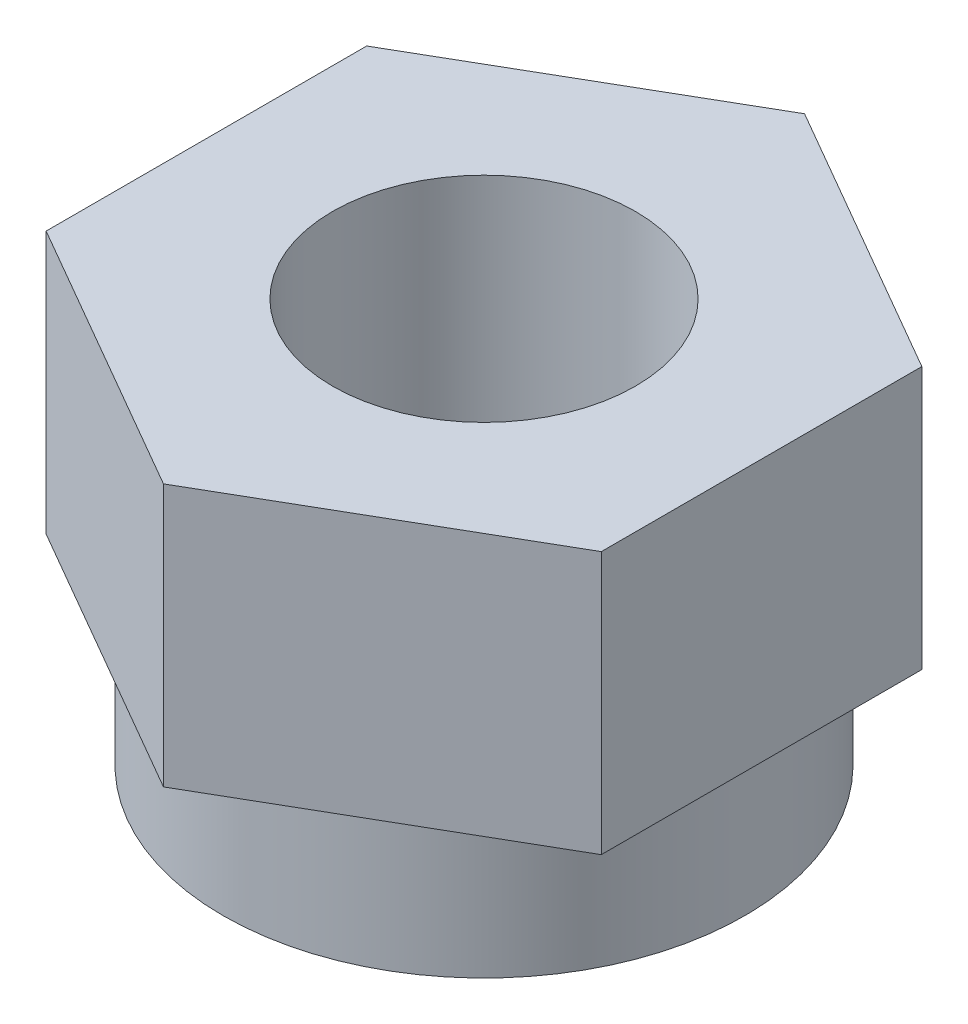
ISO-10303-21;
HEADER;
FILE_DESCRIPTION(('STEP AP214'),'2;1');
FILE_NAME('part.step','',(''),(''),'','','');
FILE_SCHEMA(('AUTOMOTIVE_DESIGN { 1 0 10303 214 1 1 1 1 }'));
ENDSEC;
DATA;
#1=APPLICATION_CONTEXT('core data for automotive mechanical design processes');
#2=APPLICATION_PROTOCOL_DEFINITION('international standard','automotive_design',2000,#1);
#3=PRODUCT_CONTEXT('',#1,'mechanical');
#4=PRODUCT('Part','Part','',(#3));
#5=PRODUCT_RELATED_PRODUCT_CATEGORY('part','',(#4));
#6=PRODUCT_DEFINITION_FORMATION('','',#4);
#7=PRODUCT_DEFINITION_CONTEXT('part definition',#1,'design');
#8=PRODUCT_DEFINITION('design','',#6,#7);
#9=PRODUCT_DEFINITION_SHAPE('','',#8);
#10=(LENGTH_UNIT() NAMED_UNIT(*) SI_UNIT(.MILLI.,.METRE.));
#11=(NAMED_UNIT(*) PLANE_ANGLE_UNIT() SI_UNIT($,.RADIAN.));
#12=(NAMED_UNIT(*) SI_UNIT($,.STERADIAN.) SOLID_ANGLE_UNIT());
#13=UNCERTAINTY_MEASURE_WITH_UNIT(LENGTH_MEASURE(1.E-05),#10,'distance_accuracy_value','');
#14=(GEOMETRIC_REPRESENTATION_CONTEXT(3) GLOBAL_UNCERTAINTY_ASSIGNED_CONTEXT((#13)) GLOBAL_UNIT_ASSIGNED_CONTEXT((#10,
#11,#12)) REPRESENTATION_CONTEXT('',''));
#15=CARTESIAN_POINT('',(0.,0.,0.));
#16=DIRECTION('',(0.,0.,1.));
#17=DIRECTION('',(1.,0.,0.));
#18=AXIS2_PLACEMENT_3D('',#15,#16,#17);
#19=CARTESIAN_POINT('',(2.75,-2.6,-1.58771324027147));
#20=DIRECTION('',(1.,0.,0.));
#21=DIRECTION('',(0.,0.,-1.));
#22=AXIS2_PLACEMENT_3D('',#19,#20,#21);
#23=PLANE('',#22);
#24=DIRECTION('',(0.,0.,-1.));
#25=VECTOR('',#24,1.);
#26=CARTESIAN_POINT('',(2.75,0.,-1.58771324027147));
#27=LINE('',#26,#25);
#28=CARTESIAN_POINT('',(2.75,0.,1.58771324027147));
#29=VERTEX_POINT('',#28);
#30=CARTESIAN_POINT('',(2.75,0.,-1.58771324027147));
#31=VERTEX_POINT('',#30);
#32=EDGE_CURVE('E126',#29,#31,#27,.T.);
#33=ORIENTED_EDGE('',*,*,#32,.F.);
#34=DIRECTION('',(0.,1.,0.));
#35=VECTOR('',#34,1.);
#36=CARTESIAN_POINT('',(2.75,-2.6,1.58771324027147));
#37=LINE('',#36,#35);
#38=CARTESIAN_POINT('',(2.75,-2.6,1.58771324027147));
#39=VERTEX_POINT('',#38);
#40=EDGE_CURVE('E11',#39,#29,#37,.T.);
#41=ORIENTED_EDGE('',*,*,#40,.F.);
#42=DIRECTION('',(0.,0.,-1.));
#43=VECTOR('',#42,1.);
#44=CARTESIAN_POINT('',(2.75,-2.6,-1.58771324027147));
#45=LINE('',#44,#43);
#46=CARTESIAN_POINT('',(2.75,-2.6,-1.58771324027147));
#47=VERTEX_POINT('',#46);
#48=EDGE_CURVE('E141',#39,#47,#45,.T.);
#49=ORIENTED_EDGE('',*,*,#48,.T.);
#50=DIRECTION('',(0.,1.,0.));
#51=VECTOR('',#50,1.);
#52=CARTESIAN_POINT('',(2.75,-2.6,-1.58771324027147));
#53=LINE('',#52,#51);
#54=EDGE_CURVE('E44',#47,#31,#53,.T.);
#55=ORIENTED_EDGE('',*,*,#54,.T.);
#56=EDGE_LOOP('',(#33,#41,#49,#55));
#57=FACE_BOUND('',#56,.T.);
#58=ADVANCED_FACE('F41',(#57),#23,.T.);
#59=CARTESIAN_POINT('',(2.75,-2.6,1.58771324027147));
#60=DIRECTION('',(0.5,0.,0.866025403784439));
#61=DIRECTION('',(0.866025403784439,0.,-0.5));
#62=AXIS2_PLACEMENT_3D('',#59,#60,#61);
#63=PLANE('',#62);
#64=DIRECTION('',(0.866025403784439,0.,-0.5));
#65=VECTOR('',#64,1.);
#66=CARTESIAN_POINT('',(2.75,0.,1.58771324027147));
#67=LINE('',#66,#65);
#68=CARTESIAN_POINT('',(0.,0.,3.17542648054294));
#69=VERTEX_POINT('',#68);
#70=EDGE_CURVE('E139',#69,#29,#67,.T.);
#71=ORIENTED_EDGE('',*,*,#70,.F.);
#72=DIRECTION('',(0.,1.,0.));
#73=VECTOR('',#72,1.);
#74=CARTESIAN_POINT('',(0.,-2.6,3.17542648054294));
#75=LINE('',#74,#73);
#76=CARTESIAN_POINT('',(0.,-2.6,3.17542648054294));
#77=VERTEX_POINT('',#76);
#78=EDGE_CURVE('E50',#77,#69,#75,.T.);
#79=ORIENTED_EDGE('',*,*,#78,.F.);
#80=DIRECTION('',(0.866025403784439,0.,-0.5));
#81=VECTOR('',#80,1.);
#82=CARTESIAN_POINT('',(2.75,-2.6,1.58771324027147));
#83=LINE('',#82,#81);
#84=EDGE_CURVE('E116',#77,#39,#83,.T.);
#85=ORIENTED_EDGE('',*,*,#84,.T.);
#86=ORIENTED_EDGE('',*,*,#40,.T.);
#87=EDGE_LOOP('',(#71,#79,#85,#86));
#88=FACE_BOUND('',#87,.T.);
#89=ADVANCED_FACE('F149',(#88),#63,.T.);
#90=CARTESIAN_POINT('',(0.,-2.6,3.17542648054294));
#91=DIRECTION('',(-0.5,0.,0.866025403784439));
#92=DIRECTION('',(0.866025403784439,0.,0.5));
#93=AXIS2_PLACEMENT_3D('',#90,#91,#92);
#94=PLANE('',#93);
#95=DIRECTION('',(0.866025403784439,0.,0.5));
#96=VECTOR('',#95,1.);
#97=CARTESIAN_POINT('',(0.,0.,3.17542648054294));
#98=LINE('',#97,#96);
#99=CARTESIAN_POINT('',(-2.75,0.,1.58771324027147));
#100=VERTEX_POINT('',#99);
#101=EDGE_CURVE('E103',#100,#69,#98,.T.);
#102=ORIENTED_EDGE('',*,*,#101,.F.);
#103=DIRECTION('',(0.,1.,0.));
#104=VECTOR('',#103,1.);
#105=CARTESIAN_POINT('',(-2.75,-2.6,1.58771324027147));
#106=LINE('',#105,#104);
#107=CARTESIAN_POINT('',(-2.75,-2.6,1.58771324027147));
#108=VERTEX_POINT('',#107);
#109=EDGE_CURVE('E98',#108,#100,#106,.T.);
#110=ORIENTED_EDGE('',*,*,#109,.F.);
#111=DIRECTION('',(0.866025403784439,0.,0.5));
#112=VECTOR('',#111,1.);
#113=CARTESIAN_POINT('',(0.,-2.6,3.17542648054294));
#114=LINE('',#113,#112);
#115=EDGE_CURVE('E101',#108,#77,#114,.T.);
#116=ORIENTED_EDGE('',*,*,#115,.T.);
#117=ORIENTED_EDGE('',*,*,#78,.T.);
#118=EDGE_LOOP('',(#102,#110,#116,#117));
#119=FACE_BOUND('',#118,.T.);
#120=ADVANCED_FACE('F100',(#119),#94,.T.);
#121=CARTESIAN_POINT('',(-2.75,-2.6,1.58771324027147));
#122=DIRECTION('',(-1.,0.,0.));
#123=DIRECTION('',(0.,0.,1.));
#124=AXIS2_PLACEMENT_3D('',#121,#122,#123);
#125=PLANE('',#124);
#126=DIRECTION('',(0.,0.,1.));
#127=VECTOR('',#126,1.);
#128=CARTESIAN_POINT('',(-2.75,0.,1.58771324027147));
#129=LINE('',#128,#127);
#130=CARTESIAN_POINT('',(-2.75,0.,-1.58771324027147));
#131=VERTEX_POINT('',#130);
#132=EDGE_CURVE('E136',#131,#100,#129,.T.);
#133=ORIENTED_EDGE('',*,*,#132,.F.);
#134=DIRECTION('',(0.,1.,0.));
#135=VECTOR('',#134,1.);
#136=CARTESIAN_POINT('',(-2.75,-2.6,-1.58771324027147));
#137=LINE('',#136,#135);
#138=CARTESIAN_POINT('',(-2.75,-2.6,-1.58771324027147));
#139=VERTEX_POINT('',#138);
#140=EDGE_CURVE('E108',#139,#131,#137,.T.);
#141=ORIENTED_EDGE('',*,*,#140,.F.);
#142=DIRECTION('',(0.,0.,1.));
#143=VECTOR('',#142,1.);
#144=CARTESIAN_POINT('',(-2.75,-2.6,1.58771324027147));
#145=LINE('',#144,#143);
#146=EDGE_CURVE('E114',#139,#108,#145,.T.);
#147=ORIENTED_EDGE('',*,*,#146,.T.);
#148=ORIENTED_EDGE('',*,*,#109,.T.);
#149=EDGE_LOOP('',(#133,#141,#147,#148));
#150=FACE_BOUND('',#149,.T.);
#151=ADVANCED_FACE('F118',(#150),#125,.T.);
#152=CARTESIAN_POINT('',(-2.75,-2.6,-1.58771324027147));
#153=DIRECTION('',(-0.5,0.,-0.866025403784439));
#154=DIRECTION('',(-0.866025403784439,0.,0.5));
#155=AXIS2_PLACEMENT_3D('',#152,#153,#154);
#156=PLANE('',#155);
#157=DIRECTION('',(-0.866025403784438,0.,0.5));
#158=VECTOR('',#157,1.);
#159=CARTESIAN_POINT('',(-2.75,0.,-1.58771324027147));
#160=LINE('',#159,#158);
#161=CARTESIAN_POINT('',(0.,0.,-3.17542648054294));
#162=VERTEX_POINT('',#161);
#163=EDGE_CURVE('E133',#162,#131,#160,.T.);
#164=ORIENTED_EDGE('',*,*,#163,.F.);
#165=DIRECTION('',(0.,1.,0.));
#166=VECTOR('',#165,1.);
#167=CARTESIAN_POINT('',(0.,-2.6,-3.17542648054294));
#168=LINE('',#167,#166);
#169=CARTESIAN_POINT('',(0.,-2.6,-3.17542648054294));
#170=VERTEX_POINT('',#169);
#171=EDGE_CURVE('E144',#170,#162,#168,.T.);
#172=ORIENTED_EDGE('',*,*,#171,.F.);
#173=DIRECTION('',(-0.866025403784438,0.,0.5));
#174=VECTOR('',#173,1.);
#175=CARTESIAN_POINT('',(-2.75,-2.6,-1.58771324027147));
#176=LINE('',#175,#174);
#177=EDGE_CURVE('E119',#170,#139,#176,.T.);
#178=ORIENTED_EDGE('',*,*,#177,.T.);
#179=ORIENTED_EDGE('',*,*,#140,.T.);
#180=EDGE_LOOP('',(#164,#172,#178,#179));
#181=FACE_BOUND('',#180,.T.);
#182=ADVANCED_FACE('F162',(#181),#156,.T.);
#183=CARTESIAN_POINT('',(0.,-2.6,-3.17542648054294));
#184=DIRECTION('',(0.5,0.,-0.866025403784439));
#185=DIRECTION('',(-0.866025403784439,0.,-0.5));
#186=AXIS2_PLACEMENT_3D('',#183,#184,#185);
#187=PLANE('',#186);
#188=DIRECTION('',(-0.866025403784439,0.,-0.5));
#189=VECTOR('',#188,1.);
#190=CARTESIAN_POINT('',(0.,0.,-3.17542648054294));
#191=LINE('',#190,#189);
#192=EDGE_CURVE('E129',#31,#162,#191,.T.);
#193=ORIENTED_EDGE('',*,*,#192,.F.);
#194=ORIENTED_EDGE('',*,*,#54,.F.);
#195=DIRECTION('',(-0.866025403784439,0.,-0.5));
#196=VECTOR('',#195,1.);
#197=CARTESIAN_POINT('',(0.,-2.6,-3.17542648054294));
#198=LINE('',#197,#196);
#199=EDGE_CURVE('E121',#47,#170,#198,.T.);
#200=ORIENTED_EDGE('',*,*,#199,.T.);
#201=ORIENTED_EDGE('',*,*,#171,.T.);
#202=EDGE_LOOP('',(#193,#194,#200,#201));
#203=FACE_BOUND('',#202,.T.);
#204=ADVANCED_FACE('F146',(#203),#187,.T.);
#205=CARTESIAN_POINT('',(0.,-2.6,0.));
#206=DIRECTION('',(0.,-1.,0.));
#207=DIRECTION('',(0.,0.,-1.));
#208=AXIS2_PLACEMENT_3D('',#205,#206,#207);
#209=PLANE('',#208);
#210=CARTESIAN_POINT('',(0.,-2.6,0.));
#211=DIRECTION('',(0.,1.,0.));
#212=DIRECTION('',(0.,0.,1.));
#213=AXIS2_PLACEMENT_3D('',#210,#211,#212);
#214=CIRCLE('',#213,2.585);
#215=CARTESIAN_POINT('',(0.,-2.6,2.585));
#216=VERTEX_POINT('',#215);
#217=EDGE_CURVE('E196',#216,#216,#214,.T.);
#218=ORIENTED_EDGE('',*,*,#217,.T.);
#219=EDGE_LOOP('',(#218));
#220=FACE_BOUND('',#219,.T.);
#221=ORIENTED_EDGE('',*,*,#48,.F.);
#222=ORIENTED_EDGE('',*,*,#84,.F.);
#223=ORIENTED_EDGE('',*,*,#115,.F.);
#224=ORIENTED_EDGE('',*,*,#146,.F.);
#225=ORIENTED_EDGE('',*,*,#177,.F.);
#226=ORIENTED_EDGE('',*,*,#199,.F.);
#227=EDGE_LOOP('',(#221,#222,#223,#224,#225,#226));
#228=FACE_BOUND('',#227,.T.);
#229=ADVANCED_FACE('F112',(#220,#228),#209,.T.);
#230=CARTESIAN_POINT('',(0.,0.,0.));
#231=DIRECTION('',(0.,-1.,0.));
#232=DIRECTION('',(0.,0.,-1.));
#233=AXIS2_PLACEMENT_3D('',#230,#231,#232);
#234=PLANE('',#233);
#235=CARTESIAN_POINT('',(0.,0.,0.));
#236=DIRECTION('',(0.,-1.,0.));
#237=DIRECTION('',(0.,0.,-1.));
#238=AXIS2_PLACEMENT_3D('',#235,#236,#237);
#239=CIRCLE('',#238,1.5);
#240=CARTESIAN_POINT('',(0.,0.,-1.5));
#241=VERTEX_POINT('',#240);
#242=EDGE_CURVE('E195',#241,#241,#239,.T.);
#243=ORIENTED_EDGE('',*,*,#242,.T.);
#244=EDGE_LOOP('',(#243));
#245=FACE_BOUND('',#244,.T.);
#246=ORIENTED_EDGE('',*,*,#32,.T.);
#247=ORIENTED_EDGE('',*,*,#192,.T.);
#248=ORIENTED_EDGE('',*,*,#163,.T.);
#249=ORIENTED_EDGE('',*,*,#132,.T.);
#250=ORIENTED_EDGE('',*,*,#101,.T.);
#251=ORIENTED_EDGE('',*,*,#70,.T.);
#252=EDGE_LOOP('',(#246,#247,#248,#249,#250,#251));
#253=FACE_BOUND('',#252,.T.);
#254=ADVANCED_FACE('F148',(#245,#253),#234,.F.);
#255=CARTESIAN_POINT('',(0.,-4.,0.));
#256=DIRECTION('',(0.,1.,0.));
#257=DIRECTION('',(0.,0.,1.));
#258=AXIS2_PLACEMENT_3D('',#255,#256,#257);
#259=CYLINDRICAL_SURFACE('',#258,2.585);
#260=CARTESIAN_POINT('',(0.,-4.,0.));
#261=DIRECTION('',(0.,1.,0.));
#262=DIRECTION('',(0.,0.,1.));
#263=AXIS2_PLACEMENT_3D('',#260,#261,#262);
#264=CIRCLE('',#263,2.585);
#265=CARTESIAN_POINT('',(0.,-4.,2.585));
#266=VERTEX_POINT('',#265);
#267=EDGE_CURVE('E130',#266,#266,#264,.T.);
#268=ORIENTED_EDGE('',*,*,#267,.T.);
#269=EDGE_LOOP('',(#268));
#270=FACE_BOUND('',#269,.T.);
#271=ORIENTED_EDGE('',*,*,#217,.F.);
#272=EDGE_LOOP('',(#271));
#273=FACE_BOUND('',#272,.T.);
#274=ADVANCED_FACE('F174',(#270,#273),#259,.T.);
#275=CARTESIAN_POINT('',(0.,-4.,0.));
#276=DIRECTION('',(0.,1.,0.));
#277=DIRECTION('',(0.,0.,1.));
#278=AXIS2_PLACEMENT_3D('',#275,#276,#277);
#279=PLANE('',#278);
#280=CARTESIAN_POINT('',(0.,-4.,0.));
#281=DIRECTION('',(0.,1.,0.));
#282=DIRECTION('',(0.,0.,1.));
#283=AXIS2_PLACEMENT_3D('',#280,#281,#282);
#284=CIRCLE('',#283,1.5);
#285=CARTESIAN_POINT('',(0.,-4.,1.5));
#286=VERTEX_POINT('',#285);
#287=EDGE_CURVE('E192',#286,#286,#284,.T.);
#288=ORIENTED_EDGE('',*,*,#287,.T.);
#289=EDGE_LOOP('',(#288));
#290=FACE_BOUND('',#289,.T.);
#291=ORIENTED_EDGE('',*,*,#267,.F.);
#292=EDGE_LOOP('',(#291));
#293=FACE_BOUND('',#292,.T.);
#294=ADVANCED_FACE('F179',(#290,#293),#279,.F.);
#295=CARTESIAN_POINT('',(0.,-4.,0.));
#296=DIRECTION('',(0.,1.,0.));
#297=DIRECTION('',(0.,0.,1.));
#298=AXIS2_PLACEMENT_3D('',#295,#296,#297);
#299=CYLINDRICAL_SURFACE('',#298,1.5);
#300=ORIENTED_EDGE('',*,*,#287,.F.);
#301=EDGE_LOOP('',(#300));
#302=FACE_BOUND('',#301,.T.);
#303=ORIENTED_EDGE('',*,*,#242,.F.);
#304=EDGE_LOOP('',(#303));
#305=FACE_BOUND('',#304,.T.);
#306=ADVANCED_FACE('F183',(#302,#305),#299,.F.);
#307=CLOSED_SHELL('',(#58,#89,#120,#151,#182,#204,#229,#254,#274,#294,#306));
#308=MANIFOLD_SOLID_BREP('B2',#307);
#309=ADVANCED_BREP_SHAPE_REPRESENTATION('',(#18,#308),#14);
#310=SHAPE_DEFINITION_REPRESENTATION(#9,#309);
ENDSEC;
END-ISO-10303-21;
